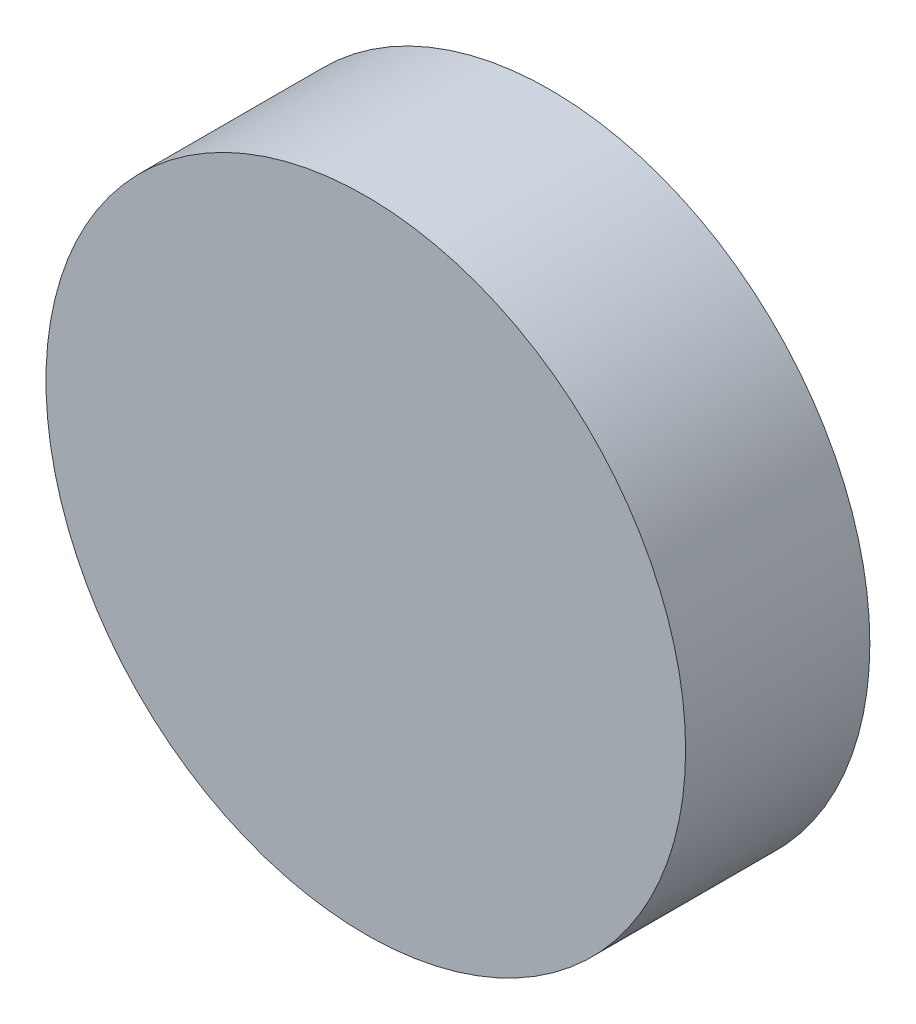
ISO-10303-21;
HEADER;
FILE_DESCRIPTION(('STEP AP214'),'2;1');
FILE_NAME('part.step','',(''),(''),'','','');
FILE_SCHEMA(('AUTOMOTIVE_DESIGN { 1 0 10303 214 1 1 1 1 }'));
ENDSEC;
DATA;
#1=APPLICATION_CONTEXT('core data for automotive mechanical design processes');
#2=APPLICATION_PROTOCOL_DEFINITION('international standard','automotive_design',2000,#1);
#3=PRODUCT_CONTEXT('',#1,'mechanical');
#4=PRODUCT('Part','Part','',(#3));
#5=PRODUCT_RELATED_PRODUCT_CATEGORY('part','',(#4));
#6=PRODUCT_DEFINITION_FORMATION('','',#4);
#7=PRODUCT_DEFINITION_CONTEXT('part definition',#1,'design');
#8=PRODUCT_DEFINITION('design','',#6,#7);
#9=PRODUCT_DEFINITION_SHAPE('','',#8);
#10=(LENGTH_UNIT() NAMED_UNIT(*) SI_UNIT(.MILLI.,.METRE.));
#11=(NAMED_UNIT(*) PLANE_ANGLE_UNIT() SI_UNIT($,.RADIAN.));
#12=(NAMED_UNIT(*) SI_UNIT($,.STERADIAN.) SOLID_ANGLE_UNIT());
#13=UNCERTAINTY_MEASURE_WITH_UNIT(LENGTH_MEASURE(1.E-05),#10,'distance_accuracy_value','');
#14=(GEOMETRIC_REPRESENTATION_CONTEXT(3) GLOBAL_UNCERTAINTY_ASSIGNED_CONTEXT((#13)) GLOBAL_UNIT_ASSIGNED_CONTEXT((#10,
#11,#12)) REPRESENTATION_CONTEXT('',''));
#15=CARTESIAN_POINT('',(0.,0.,0.));
#16=DIRECTION('',(0.,0.,1.));
#17=DIRECTION('',(1.,0.,0.));
#18=AXIS2_PLACEMENT_3D('',#15,#16,#17);
#19=CARTESIAN_POINT('',(0.,0.,10.));
#20=DIRECTION('',(0.,0.,-1.));
#21=DIRECTION('',(-1.,0.,0.));
#22=AXIS2_PLACEMENT_3D('',#19,#20,#21);
#23=CYLINDRICAL_SURFACE('',#22,17.3604912137711);
#24=CARTESIAN_POINT('',(0.,0.,10.));
#25=DIRECTION('',(0.,0.,1.));
#26=DIRECTION('',(1.,0.,0.));
#27=AXIS2_PLACEMENT_3D('',#24,#25,#26);
#28=CIRCLE('',#27,17.3604912137711);
#29=CARTESIAN_POINT('',(17.3604912137711,0.,10.));
#30=VERTEX_POINT('',#29);
#31=EDGE_CURVE('E10',#30,#30,#28,.T.);
#32=ORIENTED_EDGE('',*,*,#31,.F.);
#33=EDGE_LOOP('',(#32));
#34=FACE_BOUND('',#33,.T.);
#35=CARTESIAN_POINT('',(0.,0.,0.));
#36=DIRECTION('',(0.,0.,1.));
#37=DIRECTION('',(1.,0.,0.));
#38=AXIS2_PLACEMENT_3D('',#35,#36,#37);
#39=CIRCLE('',#38,17.3604912137711);
#40=CARTESIAN_POINT('',(17.3604912137711,0.,0.));
#41=VERTEX_POINT('',#40);
#42=EDGE_CURVE('E33',#41,#41,#39,.T.);
#43=ORIENTED_EDGE('',*,*,#42,.T.);
#44=EDGE_LOOP('',(#43));
#45=FACE_BOUND('',#44,.T.);
#46=ADVANCED_FACE('F30',(#34,#45),#23,.T.);
#47=CARTESIAN_POINT('',(0.,0.,10.));
#48=DIRECTION('',(0.,0.,1.));
#49=DIRECTION('',(1.,0.,0.));
#50=AXIS2_PLACEMENT_3D('',#47,#48,#49);
#51=PLANE('',#50);
#52=ORIENTED_EDGE('',*,*,#31,.T.);
#53=EDGE_LOOP('',(#52));
#54=FACE_BOUND('',#53,.T.);
#55=ADVANCED_FACE('F45',(#54),#51,.T.);
#56=CARTESIAN_POINT('',(0.,0.,0.));
#57=DIRECTION('',(0.,0.,1.));
#58=DIRECTION('',(1.,0.,0.));
#59=AXIS2_PLACEMENT_3D('',#56,#57,#58);
#60=PLANE('',#59);
#61=ORIENTED_EDGE('',*,*,#42,.F.);
#62=EDGE_LOOP('',(#61));
#63=FACE_BOUND('',#62,.T.);
#64=ADVANCED_FACE('F43',(#63),#60,.F.);
#65=CLOSED_SHELL('',(#46,#55,#64));
#66=MANIFOLD_SOLID_BREP('B2',#65);
#67=ADVANCED_BREP_SHAPE_REPRESENTATION('',(#18,#66),#14);
#68=SHAPE_DEFINITION_REPRESENTATION(#9,#67);
ENDSEC;
END-ISO-10303-21;
